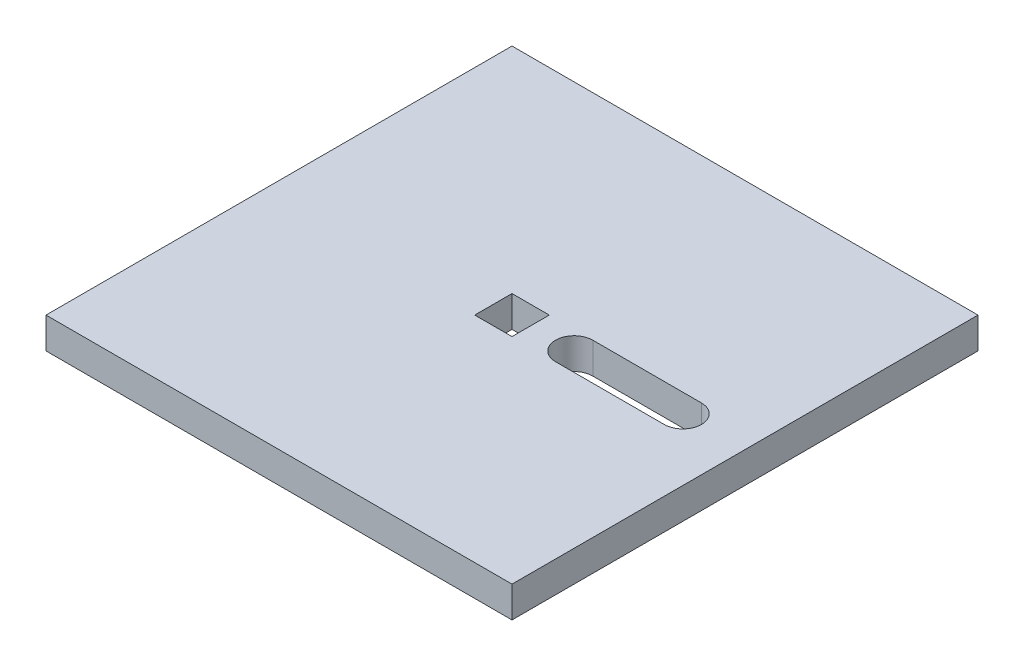
ISO-10303-21;
HEADER;
FILE_DESCRIPTION(('STEP AP214'),'2;1');
FILE_NAME('part.step','',(''),(''),'','','');
FILE_SCHEMA(('AUTOMOTIVE_DESIGN { 1 0 10303 214 1 1 1 1 }'));
ENDSEC;
DATA;
#1=APPLICATION_CONTEXT('core data for automotive mechanical design processes');
#2=APPLICATION_PROTOCOL_DEFINITION('international standard','automotive_design',2000,#1);
#3=PRODUCT_CONTEXT('',#1,'mechanical');
#4=PRODUCT('Part','Part','',(#3));
#5=PRODUCT_RELATED_PRODUCT_CATEGORY('part','',(#4));
#6=PRODUCT_DEFINITION_FORMATION('','',#4);
#7=PRODUCT_DEFINITION_CONTEXT('part definition',#1,'design');
#8=PRODUCT_DEFINITION('design','',#6,#7);
#9=PRODUCT_DEFINITION_SHAPE('','',#8);
#10=(LENGTH_UNIT() NAMED_UNIT(*) SI_UNIT(.MILLI.,.METRE.));
#11=(NAMED_UNIT(*) PLANE_ANGLE_UNIT() SI_UNIT($,.RADIAN.));
#12=(NAMED_UNIT(*) SI_UNIT($,.STERADIAN.) SOLID_ANGLE_UNIT());
#13=UNCERTAINTY_MEASURE_WITH_UNIT(LENGTH_MEASURE(1.E-05),#10,'distance_accuracy_value','');
#14=(GEOMETRIC_REPRESENTATION_CONTEXT(3) GLOBAL_UNCERTAINTY_ASSIGNED_CONTEXT((#13)) GLOBAL_UNIT_ASSIGNED_CONTEXT((#10,
#11,#12)) REPRESENTATION_CONTEXT('',''));
#15=CARTESIAN_POINT('',(0.,0.,0.));
#16=DIRECTION('',(0.,0.,1.));
#17=DIRECTION('',(1.,0.,0.));
#18=AXIS2_PLACEMENT_3D('',#15,#16,#17);
#19=CARTESIAN_POINT('',(75.0000000000455,10.,-75.0000000000455));
#20=DIRECTION('',(-1.,0.,0.));
#21=DIRECTION('',(0.,0.,1.));
#22=AXIS2_PLACEMENT_3D('',#19,#20,#21);
#23=PLANE('',#22);
#24=DIRECTION('',(0.,0.,-1.));
#25=VECTOR('',#24,1.);
#26=CARTESIAN_POINT('',(75.0000000000455,0.,-75.0000000000455));
#27=LINE('',#26,#25);
#28=CARTESIAN_POINT('',(75.0000000000455,0.,75.0000000000455));
#29=VERTEX_POINT('',#28);
#30=CARTESIAN_POINT('',(75.0000000000455,0.,-75.0000000000455));
#31=VERTEX_POINT('',#30);
#32=EDGE_CURVE('E182',#29,#31,#27,.T.);
#33=ORIENTED_EDGE('',*,*,#32,.T.);
#34=DIRECTION('',(0.,-1.,0.));
#35=VECTOR('',#34,1.);
#36=CARTESIAN_POINT('',(75.0000000000455,10.,-75.0000000000455));
#37=LINE('',#36,#35);
#38=CARTESIAN_POINT('',(75.0000000000455,10.,-75.0000000000455));
#39=VERTEX_POINT('',#38);
#40=EDGE_CURVE('E11',#39,#31,#37,.T.);
#41=ORIENTED_EDGE('',*,*,#40,.F.);
#42=DIRECTION('',(0.,0.,-1.));
#43=VECTOR('',#42,1.);
#44=CARTESIAN_POINT('',(75.0000000000455,10.,-75.0000000000455));
#45=LINE('',#44,#43);
#46=CARTESIAN_POINT('',(75.0000000000455,10.,75.0000000000455));
#47=VERTEX_POINT('',#46);
#48=EDGE_CURVE('E189',#47,#39,#45,.T.);
#49=ORIENTED_EDGE('',*,*,#48,.F.);
#50=DIRECTION('',(0.,-1.,0.));
#51=VECTOR('',#50,1.);
#52=CARTESIAN_POINT('',(75.0000000000455,10.,75.0000000000455));
#53=LINE('',#52,#51);
#54=EDGE_CURVE('E199',#47,#29,#53,.T.);
#55=ORIENTED_EDGE('',*,*,#54,.T.);
#56=EDGE_LOOP('',(#33,#41,#49,#55));
#57=FACE_BOUND('',#56,.T.);
#58=ADVANCED_FACE('F32',(#57),#23,.F.);
#59=CARTESIAN_POINT('',(-75.0000000000455,10.,-75.0000000000455));
#60=DIRECTION('',(0.,0.,1.));
#61=DIRECTION('',(1.,0.,0.));
#62=AXIS2_PLACEMENT_3D('',#59,#60,#61);
#63=PLANE('',#62);
#64=DIRECTION('',(-1.,0.,0.));
#65=VECTOR('',#64,1.);
#66=CARTESIAN_POINT('',(-75.0000000000455,0.,-75.0000000000455));
#67=LINE('',#66,#65);
#68=CARTESIAN_POINT('',(-75.0000000000455,0.,-75.0000000000455));
#69=VERTEX_POINT('',#68);
#70=EDGE_CURVE('E202',#31,#69,#67,.T.);
#71=ORIENTED_EDGE('',*,*,#70,.T.);
#72=DIRECTION('',(0.,-1.,0.));
#73=VECTOR('',#72,1.);
#74=CARTESIAN_POINT('',(-75.0000000000455,10.,-75.0000000000455));
#75=LINE('',#74,#73);
#76=CARTESIAN_POINT('',(-75.0000000000455,10.,-75.0000000000455));
#77=VERTEX_POINT('',#76);
#78=EDGE_CURVE('E39',#77,#69,#75,.T.);
#79=ORIENTED_EDGE('',*,*,#78,.F.);
#80=DIRECTION('',(-1.,0.,0.));
#81=VECTOR('',#80,1.);
#82=CARTESIAN_POINT('',(-75.0000000000455,10.,-75.0000000000455));
#83=LINE('',#82,#81);
#84=EDGE_CURVE('E192',#39,#77,#83,.T.);
#85=ORIENTED_EDGE('',*,*,#84,.F.);
#86=ORIENTED_EDGE('',*,*,#40,.T.);
#87=EDGE_LOOP('',(#71,#79,#85,#86));
#88=FACE_BOUND('',#87,.T.);
#89=ADVANCED_FACE('F231',(#88),#63,.F.);
#90=CARTESIAN_POINT('',(-75.0000000000455,10.,-75.0000000000455));
#91=DIRECTION('',(1.,0.,0.));
#92=DIRECTION('',(0.,0.,-1.));
#93=AXIS2_PLACEMENT_3D('',#90,#91,#92);
#94=PLANE('',#93);
#95=DIRECTION('',(0.,0.,1.));
#96=VECTOR('',#95,1.);
#97=CARTESIAN_POINT('',(-75.0000000000455,0.,-75.0000000000455));
#98=LINE('',#97,#96);
#99=CARTESIAN_POINT('',(-75.0000000000455,0.,75.0000000000455));
#100=VERTEX_POINT('',#99);
#101=EDGE_CURVE('E204',#69,#100,#98,.T.);
#102=ORIENTED_EDGE('',*,*,#101,.T.);
#103=DIRECTION('',(0.,-1.,0.));
#104=VECTOR('',#103,1.);
#105=CARTESIAN_POINT('',(-75.0000000000455,10.,75.0000000000455));
#106=LINE('',#105,#104);
#107=CARTESIAN_POINT('',(-75.0000000000455,10.,75.0000000000455));
#108=VERTEX_POINT('',#107);
#109=EDGE_CURVE('E209',#108,#100,#106,.T.);
#110=ORIENTED_EDGE('',*,*,#109,.F.);
#111=DIRECTION('',(0.,0.,1.));
#112=VECTOR('',#111,1.);
#113=CARTESIAN_POINT('',(-75.0000000000455,10.,-75.0000000000455));
#114=LINE('',#113,#112);
#115=EDGE_CURVE('E195',#77,#108,#114,.T.);
#116=ORIENTED_EDGE('',*,*,#115,.F.);
#117=ORIENTED_EDGE('',*,*,#78,.T.);
#118=EDGE_LOOP('',(#102,#110,#116,#117));
#119=FACE_BOUND('',#118,.T.);
#120=ADVANCED_FACE('F216',(#119),#94,.F.);
#121=CARTESIAN_POINT('',(-75.0000000000455,10.,75.0000000000455));
#122=DIRECTION('',(0.,0.,-1.));
#123=DIRECTION('',(-1.,0.,0.));
#124=AXIS2_PLACEMENT_3D('',#121,#122,#123);
#125=PLANE('',#124);
#126=DIRECTION('',(1.,0.,0.));
#127=VECTOR('',#126,1.);
#128=CARTESIAN_POINT('',(-75.0000000000455,0.,75.0000000000455));
#129=LINE('',#128,#127);
#130=EDGE_CURVE('E193',#100,#29,#129,.T.);
#131=ORIENTED_EDGE('',*,*,#130,.T.);
#132=ORIENTED_EDGE('',*,*,#54,.F.);
#133=DIRECTION('',(1.,0.,0.));
#134=VECTOR('',#133,1.);
#135=CARTESIAN_POINT('',(-75.0000000000455,10.,75.0000000000455));
#136=LINE('',#135,#134);
#137=EDGE_CURVE('E197',#108,#47,#136,.T.);
#138=ORIENTED_EDGE('',*,*,#137,.F.);
#139=ORIENTED_EDGE('',*,*,#109,.T.);
#140=EDGE_LOOP('',(#131,#132,#138,#139));
#141=FACE_BOUND('',#140,.T.);
#142=ADVANCED_FACE('F224',(#141),#125,.F.);
#143=CARTESIAN_POINT('',(0.,10.,0.));
#144=DIRECTION('',(0.,1.,0.));
#145=DIRECTION('',(0.,0.,1.));
#146=AXIS2_PLACEMENT_3D('',#143,#144,#145);
#147=PLANE('',#146);
#148=CARTESIAN_POINT('',(20.,10.,0.));
#149=DIRECTION('',(0.,1.,0.));
#150=DIRECTION('',(0.,0.,1.));
#151=AXIS2_PLACEMENT_3D('',#148,#149,#150);
#152=CIRCLE('',#151,6.);
#153=CARTESIAN_POINT('',(20.,10.,-6.));
#154=VERTEX_POINT('',#153);
#155=CARTESIAN_POINT('',(20.,10.,6.));
#156=VERTEX_POINT('',#155);
#157=EDGE_CURVE('E46',#154,#156,#152,.T.);
#158=ORIENTED_EDGE('',*,*,#157,.F.);
#159=DIRECTION('',(-1.,0.,0.));
#160=VECTOR('',#159,1.);
#161=CARTESIAN_POINT('',(20.,10.,-6.));
#162=LINE('',#161,#160);
#163=CARTESIAN_POINT('',(55.,10.,-6.));
#164=VERTEX_POINT('',#163);
#165=EDGE_CURVE('E138',#164,#154,#162,.T.);
#166=ORIENTED_EDGE('',*,*,#165,.F.);
#167=CARTESIAN_POINT('',(55.,10.,0.));
#168=DIRECTION('',(0.,1.,0.));
#169=DIRECTION('',(0.,0.,1.));
#170=AXIS2_PLACEMENT_3D('',#167,#168,#169);
#171=CIRCLE('',#170,6.);
#172=CARTESIAN_POINT('',(55.,10.,6.));
#173=VERTEX_POINT('',#172);
#174=EDGE_CURVE('E141',#173,#164,#171,.T.);
#175=ORIENTED_EDGE('',*,*,#174,.F.);
#176=DIRECTION('',(1.,0.,0.));
#177=VECTOR('',#176,1.);
#178=CARTESIAN_POINT('',(20.,10.,6.));
#179=LINE('',#178,#177);
#180=EDGE_CURVE('E147',#156,#173,#179,.T.);
#181=ORIENTED_EDGE('',*,*,#180,.F.);
#182=EDGE_LOOP('',(#158,#166,#175,#181));
#183=FACE_BOUND('',#182,.T.);
#184=DIRECTION('',(0.,0.,-1.));
#185=VECTOR('',#184,1.);
#186=CARTESIAN_POINT('',(6.,10.,-6.));
#187=LINE('',#186,#185);
#188=CARTESIAN_POINT('',(6.,10.,6.));
#189=VERTEX_POINT('',#188);
#190=CARTESIAN_POINT('',(6.,10.,-6.));
#191=VERTEX_POINT('',#190);
#192=EDGE_CURVE('E153',#189,#191,#187,.T.);
#193=ORIENTED_EDGE('',*,*,#192,.F.);
#194=DIRECTION('',(1.,0.,0.));
#195=VECTOR('',#194,1.);
#196=CARTESIAN_POINT('',(-6.,10.,6.));
#197=LINE('',#196,#195);
#198=CARTESIAN_POINT('',(-6.,10.,6.));
#199=VERTEX_POINT('',#198);
#200=EDGE_CURVE('E161',#199,#189,#197,.T.);
#201=ORIENTED_EDGE('',*,*,#200,.F.);
#202=DIRECTION('',(0.,0.,1.));
#203=VECTOR('',#202,1.);
#204=CARTESIAN_POINT('',(-6.,10.,-6.));
#205=LINE('',#204,#203);
#206=CARTESIAN_POINT('',(-6.,10.,-6.));
#207=VERTEX_POINT('',#206);
#208=EDGE_CURVE('E175',#207,#199,#205,.T.);
#209=ORIENTED_EDGE('',*,*,#208,.F.);
#210=DIRECTION('',(-1.,0.,0.));
#211=VECTOR('',#210,1.);
#212=CARTESIAN_POINT('',(-6.,10.,-6.));
#213=LINE('',#212,#211);
#214=EDGE_CURVE('E172',#191,#207,#213,.T.);
#215=ORIENTED_EDGE('',*,*,#214,.F.);
#216=EDGE_LOOP('',(#193,#201,#209,#215));
#217=FACE_BOUND('',#216,.T.);
#218=ORIENTED_EDGE('',*,*,#48,.T.);
#219=ORIENTED_EDGE('',*,*,#84,.T.);
#220=ORIENTED_EDGE('',*,*,#115,.T.);
#221=ORIENTED_EDGE('',*,*,#137,.T.);
#222=EDGE_LOOP('',(#218,#219,#220,#221));
#223=FACE_BOUND('',#222,.T.);
#224=ADVANCED_FACE('F230',(#183,#217,#223),#147,.T.);
#225=CARTESIAN_POINT('',(0.,0.,0.));
#226=DIRECTION('',(0.,1.,0.));
#227=DIRECTION('',(0.,0.,1.));
#228=AXIS2_PLACEMENT_3D('',#225,#226,#227);
#229=PLANE('',#228);
#230=DIRECTION('',(-1.,0.,0.));
#231=VECTOR('',#230,1.);
#232=CARTESIAN_POINT('',(20.,0.,-6.));
#233=LINE('',#232,#231);
#234=CARTESIAN_POINT('',(55.,0.,-6.));
#235=VERTEX_POINT('',#234);
#236=CARTESIAN_POINT('',(20.,0.,-6.));
#237=VERTEX_POINT('',#236);
#238=EDGE_CURVE('E128',#235,#237,#233,.T.);
#239=ORIENTED_EDGE('',*,*,#238,.T.);
#240=CARTESIAN_POINT('',(20.,0.,0.));
#241=DIRECTION('',(0.,1.,0.));
#242=DIRECTION('',(0.,0.,1.));
#243=AXIS2_PLACEMENT_3D('',#240,#241,#242);
#244=CIRCLE('',#243,6.);
#245=CARTESIAN_POINT('',(20.,0.,6.));
#246=VERTEX_POINT('',#245);
#247=EDGE_CURVE('E122',#237,#246,#244,.T.);
#248=ORIENTED_EDGE('',*,*,#247,.T.);
#249=DIRECTION('',(1.,0.,0.));
#250=VECTOR('',#249,1.);
#251=CARTESIAN_POINT('',(20.,0.,6.));
#252=LINE('',#251,#250);
#253=CARTESIAN_POINT('',(55.,0.,6.));
#254=VERTEX_POINT('',#253);
#255=EDGE_CURVE('E131',#246,#254,#252,.T.);
#256=ORIENTED_EDGE('',*,*,#255,.T.);
#257=CARTESIAN_POINT('',(55.,0.,0.));
#258=DIRECTION('',(0.,1.,0.));
#259=DIRECTION('',(0.,0.,1.));
#260=AXIS2_PLACEMENT_3D('',#257,#258,#259);
#261=CIRCLE('',#260,6.);
#262=EDGE_CURVE('E54',#254,#235,#261,.T.);
#263=ORIENTED_EDGE('',*,*,#262,.T.);
#264=EDGE_LOOP('',(#239,#248,#256,#263));
#265=FACE_BOUND('',#264,.T.);
#266=DIRECTION('',(1.,0.,0.));
#267=VECTOR('',#266,1.);
#268=CARTESIAN_POINT('',(-6.,0.,6.));
#269=LINE('',#268,#267);
#270=CARTESIAN_POINT('',(-6.,0.,6.));
#271=VERTEX_POINT('',#270);
#272=CARTESIAN_POINT('',(6.,0.,6.));
#273=VERTEX_POINT('',#272);
#274=EDGE_CURVE('E167',#271,#273,#269,.T.);
#275=ORIENTED_EDGE('',*,*,#274,.T.);
#276=DIRECTION('',(0.,0.,-1.));
#277=VECTOR('',#276,1.);
#278=CARTESIAN_POINT('',(6.,0.,-6.));
#279=LINE('',#278,#277);
#280=CARTESIAN_POINT('',(6.,0.,-6.));
#281=VERTEX_POINT('',#280);
#282=EDGE_CURVE('E157',#273,#281,#279,.T.);
#283=ORIENTED_EDGE('',*,*,#282,.T.);
#284=DIRECTION('',(-1.,0.,0.));
#285=VECTOR('',#284,1.);
#286=CARTESIAN_POINT('',(-6.,0.,-6.));
#287=LINE('',#286,#285);
#288=CARTESIAN_POINT('',(-6.,0.,-6.));
#289=VERTEX_POINT('',#288);
#290=EDGE_CURVE('E160',#281,#289,#287,.T.);
#291=ORIENTED_EDGE('',*,*,#290,.T.);
#292=DIRECTION('',(0.,0.,1.));
#293=VECTOR('',#292,1.);
#294=CARTESIAN_POINT('',(-6.,0.,-6.));
#295=LINE('',#294,#293);
#296=EDGE_CURVE('E164',#289,#271,#295,.T.);
#297=ORIENTED_EDGE('',*,*,#296,.T.);
#298=EDGE_LOOP('',(#275,#283,#291,#297));
#299=FACE_BOUND('',#298,.T.);
#300=ORIENTED_EDGE('',*,*,#32,.F.);
#301=ORIENTED_EDGE('',*,*,#130,.F.);
#302=ORIENTED_EDGE('',*,*,#101,.F.);
#303=ORIENTED_EDGE('',*,*,#70,.F.);
#304=EDGE_LOOP('',(#300,#301,#302,#303));
#305=FACE_BOUND('',#304,.T.);
#306=ADVANCED_FACE('F135',(#265,#299,#305),#229,.F.);
#307=CARTESIAN_POINT('',(6.,0.,-6.));
#308=DIRECTION('',(1.,0.,0.));
#309=DIRECTION('',(0.,0.,-1.));
#310=AXIS2_PLACEMENT_3D('',#307,#308,#309);
#311=PLANE('',#310);
#312=ORIENTED_EDGE('',*,*,#192,.T.);
#313=DIRECTION('',(0.,1.,0.));
#314=VECTOR('',#313,1.);
#315=CARTESIAN_POINT('',(6.,0.,-6.));
#316=LINE('',#315,#314);
#317=EDGE_CURVE('E170',#281,#191,#316,.T.);
#318=ORIENTED_EDGE('',*,*,#317,.F.);
#319=ORIENTED_EDGE('',*,*,#282,.F.);
#320=DIRECTION('',(0.,1.,0.));
#321=VECTOR('',#320,1.);
#322=CARTESIAN_POINT('',(6.,0.,6.));
#323=LINE('',#322,#321);
#324=EDGE_CURVE('E180',#273,#189,#323,.T.);
#325=ORIENTED_EDGE('',*,*,#324,.T.);
#326=EDGE_LOOP('',(#312,#318,#319,#325));
#327=FACE_BOUND('',#326,.T.);
#328=ADVANCED_FACE('F243',(#327),#311,.F.);
#329=CARTESIAN_POINT('',(-6.,0.,6.));
#330=DIRECTION('',(0.,0.,1.));
#331=DIRECTION('',(1.,0.,0.));
#332=AXIS2_PLACEMENT_3D('',#329,#330,#331);
#333=PLANE('',#332);
#334=ORIENTED_EDGE('',*,*,#200,.T.);
#335=ORIENTED_EDGE('',*,*,#324,.F.);
#336=ORIENTED_EDGE('',*,*,#274,.F.);
#337=DIRECTION('',(0.,1.,0.));
#338=VECTOR('',#337,1.);
#339=CARTESIAN_POINT('',(-6.,0.,6.));
#340=LINE('',#339,#338);
#341=EDGE_CURVE('E183',#271,#199,#340,.T.);
#342=ORIENTED_EDGE('',*,*,#341,.T.);
#343=EDGE_LOOP('',(#334,#335,#336,#342));
#344=FACE_BOUND('',#343,.T.);
#345=ADVANCED_FACE('F249',(#344),#333,.F.);
#346=CARTESIAN_POINT('',(-6.,0.,-6.));
#347=DIRECTION('',(-1.,0.,0.));
#348=DIRECTION('',(0.,0.,1.));
#349=AXIS2_PLACEMENT_3D('',#346,#347,#348);
#350=PLANE('',#349);
#351=ORIENTED_EDGE('',*,*,#208,.T.);
#352=ORIENTED_EDGE('',*,*,#341,.F.);
#353=ORIENTED_EDGE('',*,*,#296,.F.);
#354=DIRECTION('',(0.,1.,0.));
#355=VECTOR('',#354,1.);
#356=CARTESIAN_POINT('',(-6.,0.,-6.));
#357=LINE('',#356,#355);
#358=EDGE_CURVE('E185',#289,#207,#357,.T.);
#359=ORIENTED_EDGE('',*,*,#358,.T.);
#360=EDGE_LOOP('',(#351,#352,#353,#359));
#361=FACE_BOUND('',#360,.T.);
#362=ADVANCED_FACE('F254',(#361),#350,.F.);
#363=CARTESIAN_POINT('',(-6.,0.,-6.));
#364=DIRECTION('',(0.,0.,-1.));
#365=DIRECTION('',(-1.,0.,0.));
#366=AXIS2_PLACEMENT_3D('',#363,#364,#365);
#367=PLANE('',#366);
#368=ORIENTED_EDGE('',*,*,#214,.T.);
#369=ORIENTED_EDGE('',*,*,#358,.F.);
#370=ORIENTED_EDGE('',*,*,#290,.F.);
#371=ORIENTED_EDGE('',*,*,#317,.T.);
#372=EDGE_LOOP('',(#368,#369,#370,#371));
#373=FACE_BOUND('',#372,.T.);
#374=ADVANCED_FACE('F251',(#373),#367,.F.);
#375=CARTESIAN_POINT('',(20.,0.,0.));
#376=DIRECTION('',(0.,1.,0.));
#377=DIRECTION('',(0.,0.,1.));
#378=AXIS2_PLACEMENT_3D('',#375,#376,#377);
#379=CYLINDRICAL_SURFACE('',#378,6.);
#380=ORIENTED_EDGE('',*,*,#157,.T.);
#381=DIRECTION('',(0.,1.,0.));
#382=VECTOR('',#381,1.);
#383=CARTESIAN_POINT('',(20.,0.,6.));
#384=LINE('',#383,#382);
#385=EDGE_CURVE('E118',#246,#156,#384,.T.);
#386=ORIENTED_EDGE('',*,*,#385,.F.);
#387=ORIENTED_EDGE('',*,*,#247,.F.);
#388=DIRECTION('',(0.,1.,0.));
#389=VECTOR('',#388,1.);
#390=CARTESIAN_POINT('',(20.,0.,-6.));
#391=LINE('',#390,#389);
#392=EDGE_CURVE('E151',#237,#154,#391,.T.);
#393=ORIENTED_EDGE('',*,*,#392,.T.);
#394=EDGE_LOOP('',(#380,#386,#387,#393));
#395=FACE_BOUND('',#394,.T.);
#396=ADVANCED_FACE('F120',(#395),#379,.F.);
#397=CARTESIAN_POINT('',(20.,0.,-6.));
#398=DIRECTION('',(0.,0.,-1.));
#399=DIRECTION('',(-1.,0.,0.));
#400=AXIS2_PLACEMENT_3D('',#397,#398,#399);
#401=PLANE('',#400);
#402=ORIENTED_EDGE('',*,*,#165,.T.);
#403=ORIENTED_EDGE('',*,*,#392,.F.);
#404=ORIENTED_EDGE('',*,*,#238,.F.);
#405=DIRECTION('',(0.,1.,0.));
#406=VECTOR('',#405,1.);
#407=CARTESIAN_POINT('',(55.,0.,-6.));
#408=LINE('',#407,#406);
#409=EDGE_CURVE('E154',#235,#164,#408,.T.);
#410=ORIENTED_EDGE('',*,*,#409,.T.);
#411=EDGE_LOOP('',(#402,#403,#404,#410));
#412=FACE_BOUND('',#411,.T.);
#413=ADVANCED_FACE('F264',(#412),#401,.F.);
#414=CARTESIAN_POINT('',(55.,0.,0.));
#415=DIRECTION('',(0.,1.,0.));
#416=DIRECTION('',(0.,0.,1.));
#417=AXIS2_PLACEMENT_3D('',#414,#415,#416);
#418=CYLINDRICAL_SURFACE('',#417,6.);
#419=ORIENTED_EDGE('',*,*,#174,.T.);
#420=ORIENTED_EDGE('',*,*,#409,.F.);
#421=ORIENTED_EDGE('',*,*,#262,.F.);
#422=DIRECTION('',(0.,1.,0.));
#423=VECTOR('',#422,1.);
#424=CARTESIAN_POINT('',(55.,0.,6.));
#425=LINE('',#424,#423);
#426=EDGE_CURVE('E127',#254,#173,#425,.T.);
#427=ORIENTED_EDGE('',*,*,#426,.T.);
#428=EDGE_LOOP('',(#419,#420,#421,#427));
#429=FACE_BOUND('',#428,.T.);
#430=ADVANCED_FACE('F267',(#429),#418,.F.);
#431=CARTESIAN_POINT('',(20.,0.,6.));
#432=DIRECTION('',(0.,0.,1.));
#433=DIRECTION('',(1.,0.,0.));
#434=AXIS2_PLACEMENT_3D('',#431,#432,#433);
#435=PLANE('',#434);
#436=ORIENTED_EDGE('',*,*,#180,.T.);
#437=ORIENTED_EDGE('',*,*,#426,.F.);
#438=ORIENTED_EDGE('',*,*,#255,.F.);
#439=ORIENTED_EDGE('',*,*,#385,.T.);
#440=EDGE_LOOP('',(#436,#437,#438,#439));
#441=FACE_BOUND('',#440,.T.);
#442=ADVANCED_FACE('F132',(#441),#435,.F.);
#443=CLOSED_SHELL('',(#58,#89,#120,#142,#224,#306,#328,#345,#362,#374,#396,#413,#430,#442));
#444=MANIFOLD_SOLID_BREP('B2',#443);
#445=ADVANCED_BREP_SHAPE_REPRESENTATION('',(#18,#444),#14);
#446=SHAPE_DEFINITION_REPRESENTATION(#9,#445);
ENDSEC;
END-ISO-10303-21;
